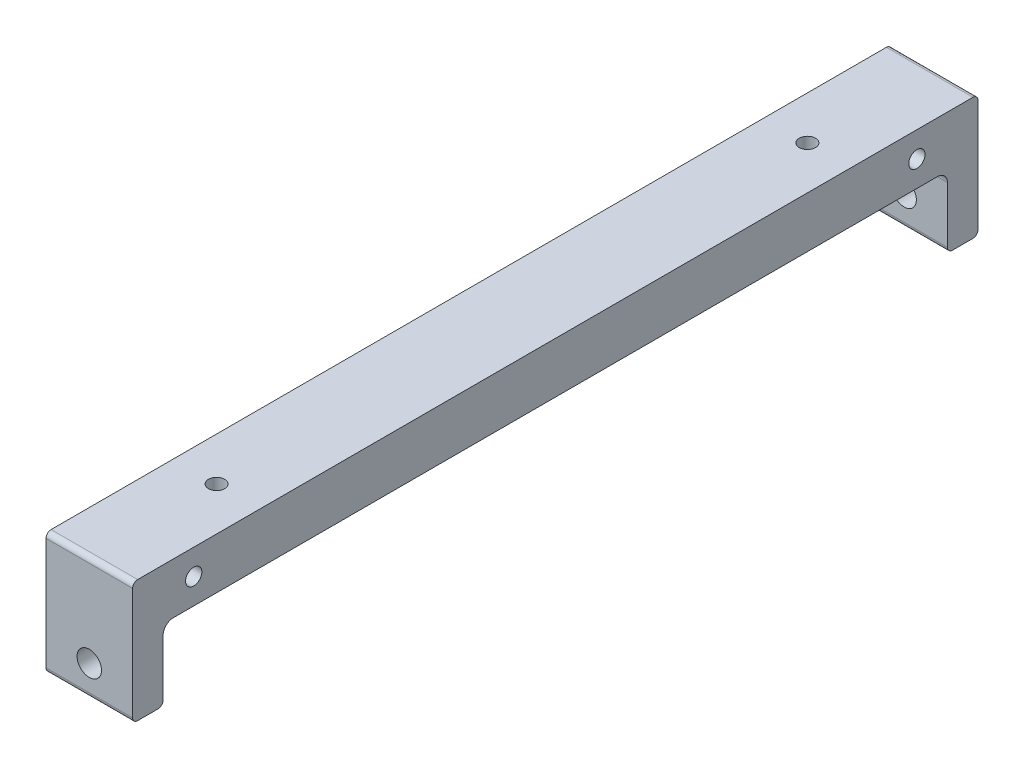
ISO-10303-21;
HEADER;
FILE_DESCRIPTION(('STEP AP214'),'2;1');
FILE_NAME('part.step','',(''),(''),'','','');
FILE_SCHEMA(('AUTOMOTIVE_DESIGN { 1 0 10303 214 1 1 1 1 }'));
ENDSEC;
DATA;
#1=APPLICATION_CONTEXT('core data for automotive mechanical design processes');
#2=APPLICATION_PROTOCOL_DEFINITION('international standard','automotive_design',2000,#1);
#3=PRODUCT_CONTEXT('',#1,'mechanical');
#4=PRODUCT('Part','Part','',(#3));
#5=PRODUCT_RELATED_PRODUCT_CATEGORY('part','',(#4));
#6=PRODUCT_DEFINITION_FORMATION('','',#4);
#7=PRODUCT_DEFINITION_CONTEXT('part definition',#1,'design');
#8=PRODUCT_DEFINITION('design','',#6,#7);
#9=PRODUCT_DEFINITION_SHAPE('','',#8);
#10=(LENGTH_UNIT() NAMED_UNIT(*) SI_UNIT(.MILLI.,.METRE.));
#11=(NAMED_UNIT(*) PLANE_ANGLE_UNIT() SI_UNIT($,.RADIAN.));
#12=(NAMED_UNIT(*) SI_UNIT($,.STERADIAN.) SOLID_ANGLE_UNIT());
#13=UNCERTAINTY_MEASURE_WITH_UNIT(LENGTH_MEASURE(1.E-05),#10,'distance_accuracy_value','');
#14=(GEOMETRIC_REPRESENTATION_CONTEXT(3) GLOBAL_UNCERTAINTY_ASSIGNED_CONTEXT((#13)) GLOBAL_UNIT_ASSIGNED_CONTEXT((#10,
#11,#12)) REPRESENTATION_CONTEXT('',''));
#15=CARTESIAN_POINT('',(0.,0.,0.));
#16=DIRECTION('',(0.,0.,1.));
#17=DIRECTION('',(1.,0.,0.));
#18=AXIS2_PLACEMENT_3D('',#15,#16,#17);
#19=CARTESIAN_POINT('',(-4.25,-6.,41.5));
#20=DIRECTION('',(0.,1.,0.));
#21=DIRECTION('',(0.,0.,1.));
#22=AXIS2_PLACEMENT_3D('',#19,#20,#21);
#23=PLANE('',#22);
#24=DIRECTION('',(0.,0.,-1.));
#25=VECTOR('',#24,1.);
#26=CARTESIAN_POINT('',(-4.25,-6.,41.5));
#27=LINE('',#26,#25);
#28=CARTESIAN_POINT('',(-4.25,-6.,41.));
#29=VERTEX_POINT('',#28);
#30=CARTESIAN_POINT('',(-4.25,-6.,39.));
#31=VERTEX_POINT('',#30);
#32=EDGE_CURVE('E272',#29,#31,#27,.T.);
#33=ORIENTED_EDGE('',*,*,#32,.T.);
#34=DIRECTION('',(1.,0.,0.));
#35=VECTOR('',#34,1.);
#36=CARTESIAN_POINT('',(-4.25,-6.,39.));
#37=LINE('',#36,#35);
#38=CARTESIAN_POINT('',(4.25,-6.,39.));
#39=VERTEX_POINT('',#38);
#40=EDGE_CURVE('E317',#31,#39,#37,.T.);
#41=ORIENTED_EDGE('',*,*,#40,.T.);
#42=DIRECTION('',(0.,0.,-1.));
#43=VECTOR('',#42,1.);
#44=CARTESIAN_POINT('',(4.25,-6.,41.5));
#45=LINE('',#44,#43);
#46=CARTESIAN_POINT('',(4.25,-6.,41.));
#47=VERTEX_POINT('',#46);
#48=EDGE_CURVE('E268',#47,#39,#45,.T.);
#49=ORIENTED_EDGE('',*,*,#48,.F.);
#50=DIRECTION('',(1.,0.,0.));
#51=VECTOR('',#50,1.);
#52=CARTESIAN_POINT('',(-4.25,-6.,41.));
#53=LINE('',#52,#51);
#54=EDGE_CURVE('E315',#47,#29,#53,.F.);
#55=ORIENTED_EDGE('',*,*,#54,.T.);
#56=EDGE_LOOP('',(#33,#41,#49,#55));
#57=FACE_BOUND('',#56,.T.);
#58=ADVANCED_FACE('F33',(#57),#23,.F.);
#59=CARTESIAN_POINT('',(4.25,-6.,41.5));
#60=DIRECTION('',(-1.,0.,0.));
#61=DIRECTION('',(0.,0.,1.));
#62=AXIS2_PLACEMENT_3D('',#59,#60,#61);
#63=PLANE('',#62);
#64=CARTESIAN_POINT('',(4.25,3.5,35.5));
#65=DIRECTION('',(1.,0.,0.));
#66=DIRECTION('',(0.,0.,-1.));
#67=AXIS2_PLACEMENT_3D('',#64,#65,#66);
#68=CIRCLE('',#67,0.799999999999999);
#69=CARTESIAN_POINT('',(4.25,3.5,34.7));
#70=VERTEX_POINT('',#69);
#71=EDGE_CURVE('E206',#70,#70,#68,.T.);
#72=ORIENTED_EDGE('',*,*,#71,.F.);
#73=EDGE_LOOP('',(#72));
#74=FACE_BOUND('',#73,.T.);
#75=CARTESIAN_POINT('',(4.25,3.5,-35.5));
#76=DIRECTION('',(1.,0.,0.));
#77=DIRECTION('',(0.,0.,-1.));
#78=AXIS2_PLACEMENT_3D('',#75,#76,#77);
#79=CIRCLE('',#78,0.799999999999999);
#80=CARTESIAN_POINT('',(4.25,3.5,-36.3));
#81=VERTEX_POINT('',#80);
#82=EDGE_CURVE('E212',#81,#81,#79,.T.);
#83=ORIENTED_EDGE('',*,*,#82,.F.);
#84=EDGE_LOOP('',(#83));
#85=FACE_BOUND('',#84,.T.);
#86=CARTESIAN_POINT('',(4.25,-6.,-39.));
#87=VERTEX_POINT('',#86);
#88=CARTESIAN_POINT('',(4.25,-6.,-41.));
#89=VERTEX_POINT('',#88);
#90=EDGE_CURVE('E263',#87,#89,#45,.T.);
#91=ORIENTED_EDGE('',*,*,#90,.T.);
#92=CARTESIAN_POINT('',(4.25,-5.5,-41.));
#93=DIRECTION('',(-1.,0.,0.));
#94=DIRECTION('',(0.,0.,1.));
#95=AXIS2_PLACEMENT_3D('',#92,#93,#94);
#96=CIRCLE('',#95,0.5);
#97=CARTESIAN_POINT('',(4.25,-5.5,-41.5));
#98=VERTEX_POINT('',#97);
#99=EDGE_CURVE('E296',#89,#98,#96,.F.);
#100=ORIENTED_EDGE('',*,*,#99,.T.);
#101=DIRECTION('',(0.,1.,0.));
#102=VECTOR('',#101,1.);
#103=CARTESIAN_POINT('',(4.25,-6.,-41.5));
#104=LINE('',#103,#102);
#105=CARTESIAN_POINT('',(4.25,5.5,-41.5));
#106=VERTEX_POINT('',#105);
#107=EDGE_CURVE('E249',#98,#106,#104,.T.);
#108=ORIENTED_EDGE('',*,*,#107,.T.);
#109=CARTESIAN_POINT('',(4.25,5.5,-41.));
#110=DIRECTION('',(-1.,0.,0.));
#111=DIRECTION('',(0.,0.,1.));
#112=AXIS2_PLACEMENT_3D('',#109,#110,#111);
#113=CIRCLE('',#112,0.5);
#114=CARTESIAN_POINT('',(4.25,6.,-41.));
#115=VERTEX_POINT('',#114);
#116=EDGE_CURVE('E288',#106,#115,#113,.F.);
#117=ORIENTED_EDGE('',*,*,#116,.T.);
#118=DIRECTION('',(0.,0.,-1.));
#119=VECTOR('',#118,1.);
#120=CARTESIAN_POINT('',(4.25,6.,41.5));
#121=LINE('',#120,#119);
#122=CARTESIAN_POINT('',(4.25,6.,41.));
#123=VERTEX_POINT('',#122);
#124=EDGE_CURVE('E278',#123,#115,#121,.T.);
#125=ORIENTED_EDGE('',*,*,#124,.F.);
#126=CARTESIAN_POINT('',(4.25,5.5,41.));
#127=DIRECTION('',(-1.,0.,0.));
#128=DIRECTION('',(0.,0.,1.));
#129=AXIS2_PLACEMENT_3D('',#126,#127,#128);
#130=CIRCLE('',#129,0.5);
#131=CARTESIAN_POINT('',(4.25,5.5,41.5));
#132=VERTEX_POINT('',#131);
#133=EDGE_CURVE('E286',#123,#132,#130,.F.);
#134=ORIENTED_EDGE('',*,*,#133,.T.);
#135=DIRECTION('',(0.,1.,0.));
#136=VECTOR('',#135,1.);
#137=CARTESIAN_POINT('',(4.25,-6.,41.5));
#138=LINE('',#137,#136);
#139=CARTESIAN_POINT('',(4.25,-5.5,41.5));
#140=VERTEX_POINT('',#139);
#141=EDGE_CURVE('E256',#140,#132,#138,.T.);
#142=ORIENTED_EDGE('',*,*,#141,.F.);
#143=CARTESIAN_POINT('',(4.25,-5.5,41.));
#144=DIRECTION('',(-1.,0.,0.));
#145=DIRECTION('',(0.,0.,1.));
#146=AXIS2_PLACEMENT_3D('',#143,#144,#145);
#147=CIRCLE('',#146,0.5);
#148=EDGE_CURVE('E290',#140,#47,#147,.F.);
#149=ORIENTED_EDGE('',*,*,#148,.T.);
#150=ORIENTED_EDGE('',*,*,#48,.T.);
#151=CARTESIAN_POINT('',(4.25,-5.5,39.));
#152=DIRECTION('',(-1.,0.,0.));
#153=DIRECTION('',(0.,0.,1.));
#154=AXIS2_PLACEMENT_3D('',#151,#152,#153);
#155=CIRCLE('',#154,0.5);
#156=CARTESIAN_POINT('',(4.25,-5.5,38.5));
#157=VERTEX_POINT('',#156);
#158=EDGE_CURVE('E292',#39,#157,#155,.F.);
#159=ORIENTED_EDGE('',*,*,#158,.T.);
#160=DIRECTION('',(0.,-1.,0.));
#161=VECTOR('',#160,1.);
#162=CARTESIAN_POINT('',(4.25,-6.00000000000001,38.5));
#163=LINE('',#162,#161);
#164=CARTESIAN_POINT('',(4.25,0.,38.5));
#165=VERTEX_POINT('',#164);
#166=EDGE_CURVE('E222',#165,#157,#163,.T.);
#167=ORIENTED_EDGE('',*,*,#166,.F.);
#168=CARTESIAN_POINT('',(4.25,0.,37.5));
#169=DIRECTION('',(1.,0.,0.));
#170=DIRECTION('',(0.,0.,-1.));
#171=AXIS2_PLACEMENT_3D('',#168,#169,#170);
#172=CIRCLE('',#171,1.);
#173=CARTESIAN_POINT('',(4.25,1.,37.5));
#174=VERTEX_POINT('',#173);
#175=EDGE_CURVE('E242',#174,#165,#172,.T.);
#176=ORIENTED_EDGE('',*,*,#175,.F.);
#177=DIRECTION('',(0.,0.,1.));
#178=VECTOR('',#177,1.);
#179=CARTESIAN_POINT('',(4.25,1.,37.5));
#180=LINE('',#179,#178);
#181=CARTESIAN_POINT('',(4.25,1.,-37.5));
#182=VERTEX_POINT('',#181);
#183=EDGE_CURVE('E239',#182,#174,#180,.T.);
#184=ORIENTED_EDGE('',*,*,#183,.F.);
#185=CARTESIAN_POINT('',(4.25,0.,-37.5));
#186=DIRECTION('',(1.,0.,0.));
#187=DIRECTION('',(0.,0.,1.));
#188=AXIS2_PLACEMENT_3D('',#185,#186,#187);
#189=CIRCLE('',#188,1.);
#190=CARTESIAN_POINT('',(4.25,0.,-38.5));
#191=VERTEX_POINT('',#190);
#192=EDGE_CURVE('E236',#191,#182,#189,.T.);
#193=ORIENTED_EDGE('',*,*,#192,.F.);
#194=DIRECTION('',(0.,1.,0.));
#195=VECTOR('',#194,1.);
#196=CARTESIAN_POINT('',(4.25,0.,-38.5));
#197=LINE('',#196,#195);
#198=CARTESIAN_POINT('',(4.25,-5.5,-38.5));
#199=VERTEX_POINT('',#198);
#200=EDGE_CURVE('E218',#199,#191,#197,.T.);
#201=ORIENTED_EDGE('',*,*,#200,.F.);
#202=CARTESIAN_POINT('',(4.25,-5.5,-39.));
#203=DIRECTION('',(-1.,0.,0.));
#204=DIRECTION('',(0.,0.,1.));
#205=AXIS2_PLACEMENT_3D('',#202,#203,#204);
#206=CIRCLE('',#205,0.5);
#207=EDGE_CURVE('E294',#199,#87,#206,.F.);
#208=ORIENTED_EDGE('',*,*,#207,.T.);
#209=EDGE_LOOP('',(#91,#100,#108,#117,#125,#134,#142,#149,#150,#159,#167,#176,#184,#193,#201,#208));
#210=FACE_BOUND('',#209,.T.);
#211=ADVANCED_FACE('F345',(#74,#85,#210),#63,.F.);
#212=CARTESIAN_POINT('',(-4.25,6.,41.5));
#213=DIRECTION('',(0.,-1.,0.));
#214=DIRECTION('',(0.,0.,-1.));
#215=AXIS2_PLACEMENT_3D('',#212,#213,#214);
#216=PLANE('',#215);
#217=CARTESIAN_POINT('',(0.,6.,-29.));
#218=DIRECTION('',(0.,1.,0.));
#219=DIRECTION('',(0.,0.,1.));
#220=AXIS2_PLACEMENT_3D('',#217,#218,#219);
#221=CIRCLE('',#220,0.799999999999998);
#222=CARTESIAN_POINT('',(0.,6.,-28.2));
#223=VERTEX_POINT('',#222);
#224=EDGE_CURVE('E172',#223,#223,#221,.T.);
#225=ORIENTED_EDGE('',*,*,#224,.F.);
#226=EDGE_LOOP('',(#225));
#227=FACE_BOUND('',#226,.T.);
#228=CARTESIAN_POINT('',(0.,6.,29.));
#229=DIRECTION('',(0.,1.,0.));
#230=DIRECTION('',(0.,0.,1.));
#231=AXIS2_PLACEMENT_3D('',#228,#229,#230);
#232=CIRCLE('',#231,0.799999999999998);
#233=CARTESIAN_POINT('',(0.,6.,29.8));
#234=VERTEX_POINT('',#233);
#235=EDGE_CURVE('E182',#234,#234,#232,.T.);
#236=ORIENTED_EDGE('',*,*,#235,.F.);
#237=EDGE_LOOP('',(#236));
#238=FACE_BOUND('',#237,.T.);
#239=ORIENTED_EDGE('',*,*,#124,.T.);
#240=DIRECTION('',(-1.,0.,0.));
#241=VECTOR('',#240,1.);
#242=CARTESIAN_POINT('',(-4.25,6.,-41.));
#243=LINE('',#242,#241);
#244=CARTESIAN_POINT('',(-4.25,6.,-41.));
#245=VERTEX_POINT('',#244);
#246=EDGE_CURVE('E11',#115,#245,#243,.T.);
#247=ORIENTED_EDGE('',*,*,#246,.T.);
#248=DIRECTION('',(0.,0.,-1.));
#249=VECTOR('',#248,1.);
#250=CARTESIAN_POINT('',(-4.25,6.,41.5));
#251=LINE('',#250,#249);
#252=CARTESIAN_POINT('',(-4.25,6.,41.));
#253=VERTEX_POINT('',#252);
#254=EDGE_CURVE('E275',#253,#245,#251,.T.);
#255=ORIENTED_EDGE('',*,*,#254,.F.);
#256=DIRECTION('',(-1.,0.,0.));
#257=VECTOR('',#256,1.);
#258=CARTESIAN_POINT('',(-4.25,6.,41.));
#259=LINE('',#258,#257);
#260=EDGE_CURVE('E42',#253,#123,#259,.F.);
#261=ORIENTED_EDGE('',*,*,#260,.T.);
#262=EDGE_LOOP('',(#239,#247,#255,#261));
#263=FACE_BOUND('',#262,.T.);
#264=ADVANCED_FACE('F353',(#227,#238,#263),#216,.F.);
#265=CARTESIAN_POINT('',(-4.25,-6.,41.5));
#266=DIRECTION('',(1.,0.,0.));
#267=DIRECTION('',(0.,0.,-1.));
#268=AXIS2_PLACEMENT_3D('',#265,#266,#267);
#269=PLANE('',#268);
#270=CARTESIAN_POINT('',(-4.25,3.5,0.));
#271=DIRECTION('',(-1.,0.,0.));
#272=DIRECTION('',(0.,0.,1.));
#273=AXIS2_PLACEMENT_3D('',#270,#271,#272);
#274=CIRCLE('',#273,0.799999999999999);
#275=CARTESIAN_POINT('',(-4.25,3.5,0.799999999999999));
#276=VERTEX_POINT('',#275);
#277=EDGE_CURVE('E173',#276,#276,#274,.T.);
#278=ORIENTED_EDGE('',*,*,#277,.F.);
#279=EDGE_LOOP('',(#278));
#280=FACE_BOUND('',#279,.T.);
#281=CARTESIAN_POINT('',(-4.25,3.5,-21.5));
#282=DIRECTION('',(-1.,0.,0.));
#283=DIRECTION('',(0.,0.,1.));
#284=AXIS2_PLACEMENT_3D('',#281,#282,#283);
#285=CIRCLE('',#284,0.799999999999999);
#286=CARTESIAN_POINT('',(-4.25,3.5,-20.7));
#287=VERTEX_POINT('',#286);
#288=EDGE_CURVE('E194',#287,#287,#285,.T.);
#289=ORIENTED_EDGE('',*,*,#288,.F.);
#290=EDGE_LOOP('',(#289));
#291=FACE_BOUND('',#290,.T.);
#292=CARTESIAN_POINT('',(-4.25,3.5,21.5));
#293=DIRECTION('',(-1.,0.,0.));
#294=DIRECTION('',(0.,0.,1.));
#295=AXIS2_PLACEMENT_3D('',#292,#293,#294);
#296=CIRCLE('',#295,0.799999999999999);
#297=CARTESIAN_POINT('',(-4.25,3.5,22.3));
#298=VERTEX_POINT('',#297);
#299=EDGE_CURVE('E200',#298,#298,#296,.T.);
#300=ORIENTED_EDGE('',*,*,#299,.F.);
#301=EDGE_LOOP('',(#300));
#302=FACE_BOUND('',#301,.T.);
#303=DIRECTION('',(0.,-1.,0.));
#304=VECTOR('',#303,1.);
#305=CARTESIAN_POINT('',(-4.25,-6.,-41.5));
#306=LINE('',#305,#304);
#307=CARTESIAN_POINT('',(-4.25,5.5,-41.5));
#308=VERTEX_POINT('',#307);
#309=CARTESIAN_POINT('',(-4.25,-5.5,-41.5));
#310=VERTEX_POINT('',#309);
#311=EDGE_CURVE('E260',#308,#310,#306,.T.);
#312=ORIENTED_EDGE('',*,*,#311,.T.);
#313=CARTESIAN_POINT('',(-4.25,-5.5,-41.));
#314=DIRECTION('',(1.,0.,0.));
#315=DIRECTION('',(0.,0.,-1.));
#316=AXIS2_PLACEMENT_3D('',#313,#314,#315);
#317=CIRCLE('',#316,0.5);
#318=CARTESIAN_POINT('',(-4.25,-6.,-41.));
#319=VERTEX_POINT('',#318);
#320=EDGE_CURVE('E310',#310,#319,#317,.F.);
#321=ORIENTED_EDGE('',*,*,#320,.T.);
#322=CARTESIAN_POINT('',(-4.25,-6.,-39.));
#323=VERTEX_POINT('',#322);
#324=EDGE_CURVE('E271',#323,#319,#27,.T.);
#325=ORIENTED_EDGE('',*,*,#324,.F.);
#326=CARTESIAN_POINT('',(-4.25,-5.5,-39.));
#327=DIRECTION('',(1.,0.,0.));
#328=DIRECTION('',(0.,0.,-1.));
#329=AXIS2_PLACEMENT_3D('',#326,#327,#328);
#330=CIRCLE('',#329,0.5);
#331=CARTESIAN_POINT('',(-4.25,-5.5,-38.5));
#332=VERTEX_POINT('',#331);
#333=EDGE_CURVE('E50',#323,#332,#330,.F.);
#334=ORIENTED_EDGE('',*,*,#333,.T.);
#335=DIRECTION('',(0.,1.,0.));
#336=VECTOR('',#335,1.);
#337=CARTESIAN_POINT('',(-4.25,0.,-38.5));
#338=LINE('',#337,#336);
#339=CARTESIAN_POINT('',(-4.25,0.,-38.5));
#340=VERTEX_POINT('',#339);
#341=EDGE_CURVE('E219',#332,#340,#338,.T.);
#342=ORIENTED_EDGE('',*,*,#341,.T.);
#343=CARTESIAN_POINT('',(-4.25,0.,-37.5));
#344=DIRECTION('',(1.,0.,0.));
#345=DIRECTION('',(0.,0.,1.));
#346=AXIS2_PLACEMENT_3D('',#343,#344,#345);
#347=CIRCLE('',#346,1.);
#348=CARTESIAN_POINT('',(-4.25,1.,-37.5));
#349=VERTEX_POINT('',#348);
#350=EDGE_CURVE('E221',#340,#349,#347,.T.);
#351=ORIENTED_EDGE('',*,*,#350,.T.);
#352=DIRECTION('',(0.,0.,1.));
#353=VECTOR('',#352,1.);
#354=CARTESIAN_POINT('',(-4.25,1.,37.5));
#355=LINE('',#354,#353);
#356=CARTESIAN_POINT('',(-4.25,1.,37.5));
#357=VERTEX_POINT('',#356);
#358=EDGE_CURVE('E225',#349,#357,#355,.T.);
#359=ORIENTED_EDGE('',*,*,#358,.T.);
#360=CARTESIAN_POINT('',(-4.25,0.,37.5));
#361=DIRECTION('',(1.,0.,0.));
#362=DIRECTION('',(0.,0.,-1.));
#363=AXIS2_PLACEMENT_3D('',#360,#361,#362);
#364=CIRCLE('',#363,1.);
#365=CARTESIAN_POINT('',(-4.25,0.,38.5));
#366=VERTEX_POINT('',#365);
#367=EDGE_CURVE('E228',#357,#366,#364,.T.);
#368=ORIENTED_EDGE('',*,*,#367,.T.);
#369=DIRECTION('',(0.,-1.,0.));
#370=VECTOR('',#369,1.);
#371=CARTESIAN_POINT('',(-4.25,-6.00000000000001,38.5));
#372=LINE('',#371,#370);
#373=CARTESIAN_POINT('',(-4.25,-5.5,38.5));
#374=VERTEX_POINT('',#373);
#375=EDGE_CURVE('E231',#366,#374,#372,.T.);
#376=ORIENTED_EDGE('',*,*,#375,.T.);
#377=CARTESIAN_POINT('',(-4.25,-5.5,39.));
#378=DIRECTION('',(1.,0.,0.));
#379=DIRECTION('',(0.,0.,-1.));
#380=AXIS2_PLACEMENT_3D('',#377,#378,#379);
#381=CIRCLE('',#380,0.5);
#382=EDGE_CURVE('E307',#374,#31,#381,.F.);
#383=ORIENTED_EDGE('',*,*,#382,.T.);
#384=ORIENTED_EDGE('',*,*,#32,.F.);
#385=CARTESIAN_POINT('',(-4.25,-5.5,41.));
#386=DIRECTION('',(1.,0.,0.));
#387=DIRECTION('',(0.,0.,-1.));
#388=AXIS2_PLACEMENT_3D('',#385,#386,#387);
#389=CIRCLE('',#388,0.5);
#390=CARTESIAN_POINT('',(-4.25,-5.5,41.5));
#391=VERTEX_POINT('',#390);
#392=EDGE_CURVE('E305',#29,#391,#389,.F.);
#393=ORIENTED_EDGE('',*,*,#392,.T.);
#394=DIRECTION('',(0.,-1.,0.));
#395=VECTOR('',#394,1.);
#396=CARTESIAN_POINT('',(-4.25,-6.,41.5));
#397=LINE('',#396,#395);
#398=CARTESIAN_POINT('',(-4.25,5.5,41.5));
#399=VERTEX_POINT('',#398);
#400=EDGE_CURVE('E259',#399,#391,#397,.T.);
#401=ORIENTED_EDGE('',*,*,#400,.F.);
#402=CARTESIAN_POINT('',(-4.25,5.5,41.));
#403=DIRECTION('',(1.,0.,0.));
#404=DIRECTION('',(0.,0.,-1.));
#405=AXIS2_PLACEMENT_3D('',#402,#403,#404);
#406=CIRCLE('',#405,0.5);
#407=EDGE_CURVE('E302',#399,#253,#406,.F.);
#408=ORIENTED_EDGE('',*,*,#407,.T.);
#409=ORIENTED_EDGE('',*,*,#254,.T.);
#410=CARTESIAN_POINT('',(-4.25,5.5,-41.));
#411=DIRECTION('',(1.,0.,0.));
#412=DIRECTION('',(0.,0.,-1.));
#413=AXIS2_PLACEMENT_3D('',#410,#411,#412);
#414=CIRCLE('',#413,0.5);
#415=EDGE_CURVE('E58',#245,#308,#414,.F.);
#416=ORIENTED_EDGE('',*,*,#415,.T.);
#417=EDGE_LOOP('',(#312,#321,#325,#334,#342,#351,#359,#368,#376,#383,#384,#393,#401,#408,#409,#416));
#418=FACE_BOUND('',#417,.T.);
#419=ADVANCED_FACE('F360',(#280,#291,#302,#418),#269,.F.);
#420=ORIENTED_EDGE('',*,*,#324,.T.);
#421=DIRECTION('',(1.,0.,0.));
#422=VECTOR('',#421,1.);
#423=CARTESIAN_POINT('',(4.25,-6.,-41.));
#424=LINE('',#423,#422);
#425=EDGE_CURVE('E283',#319,#89,#424,.T.);
#426=ORIENTED_EDGE('',*,*,#425,.T.);
#427=ORIENTED_EDGE('',*,*,#90,.F.);
#428=DIRECTION('',(1.,0.,0.));
#429=VECTOR('',#428,1.);
#430=CARTESIAN_POINT('',(-4.25,-6.,-39.));
#431=LINE('',#430,#429);
#432=EDGE_CURVE('E281',#87,#323,#431,.F.);
#433=ORIENTED_EDGE('',*,*,#432,.T.);
#434=EDGE_LOOP('',(#420,#426,#427,#433));
#435=FACE_BOUND('',#434,.T.);
#436=ADVANCED_FACE('F348',(#435),#23,.F.);
#437=CARTESIAN_POINT('',(0.,0.,41.5));
#438=DIRECTION('',(0.,0.,-1.));
#439=DIRECTION('',(-1.,0.,0.));
#440=AXIS2_PLACEMENT_3D('',#437,#438,#439);
#441=PLANE('',#440);
#442=CARTESIAN_POINT('',(0.,-3.,41.5));
#443=DIRECTION('',(0.,0.,1.));
#444=DIRECTION('',(1.,0.,0.));
#445=AXIS2_PLACEMENT_3D('',#442,#443,#444);
#446=CIRCLE('',#445,1.2);
#447=CARTESIAN_POINT('',(1.2,-3.,41.5));
#448=VERTEX_POINT('',#447);
#449=EDGE_CURVE('E188',#448,#448,#446,.T.);
#450=ORIENTED_EDGE('',*,*,#449,.F.);
#451=EDGE_LOOP('',(#450));
#452=FACE_BOUND('',#451,.T.);
#453=ORIENTED_EDGE('',*,*,#400,.T.);
#454=DIRECTION('',(1.,0.,0.));
#455=VECTOR('',#454,1.);
#456=CARTESIAN_POINT('',(0.,-5.5,41.5));
#457=LINE('',#456,#455);
#458=EDGE_CURVE('E325',#391,#140,#457,.T.);
#459=ORIENTED_EDGE('',*,*,#458,.T.);
#460=ORIENTED_EDGE('',*,*,#141,.T.);
#461=DIRECTION('',(-1.,0.,0.));
#462=VECTOR('',#461,1.);
#463=CARTESIAN_POINT('',(0.,5.5,41.5));
#464=LINE('',#463,#462);
#465=EDGE_CURVE('E322',#132,#399,#464,.T.);
#466=ORIENTED_EDGE('',*,*,#465,.T.);
#467=EDGE_LOOP('',(#453,#459,#460,#466));
#468=FACE_BOUND('',#467,.T.);
#469=ADVANCED_FACE('F359',(#452,#468),#441,.F.);
#470=CARTESIAN_POINT('',(0.,0.,-41.5));
#471=DIRECTION('',(0.,0.,-1.));
#472=DIRECTION('',(-1.,0.,0.));
#473=AXIS2_PLACEMENT_3D('',#470,#471,#472);
#474=PLANE('',#473);
#475=CARTESIAN_POINT('',(0.,-3.,-41.5));
#476=DIRECTION('',(0.,0.,-1.));
#477=DIRECTION('',(-1.,0.,0.));
#478=AXIS2_PLACEMENT_3D('',#475,#476,#477);
#479=CIRCLE('',#478,1.19999999999999);
#480=CARTESIAN_POINT('',(-1.19999999999999,-3.,-41.5));
#481=VERTEX_POINT('',#480);
#482=EDGE_CURVE('E479',#481,#481,#479,.T.);
#483=ORIENTED_EDGE('',*,*,#482,.F.);
#484=EDGE_LOOP('',(#483));
#485=FACE_BOUND('',#484,.T.);
#486=ORIENTED_EDGE('',*,*,#107,.F.);
#487=DIRECTION('',(1.,0.,0.));
#488=VECTOR('',#487,1.);
#489=CARTESIAN_POINT('',(-4.25,-5.5,-41.5));
#490=LINE('',#489,#488);
#491=EDGE_CURVE('E300',#98,#310,#490,.F.);
#492=ORIENTED_EDGE('',*,*,#491,.T.);
#493=ORIENTED_EDGE('',*,*,#311,.F.);
#494=DIRECTION('',(-1.,0.,0.));
#495=VECTOR('',#494,1.);
#496=CARTESIAN_POINT('',(4.25,5.5,-41.5));
#497=LINE('',#496,#495);
#498=EDGE_CURVE('E298',#308,#106,#497,.F.);
#499=ORIENTED_EDGE('',*,*,#498,.T.);
#500=EDGE_LOOP('',(#486,#492,#493,#499));
#501=FACE_BOUND('',#500,.T.);
#502=ADVANCED_FACE('F367',(#485,#501),#474,.T.);
#503=CARTESIAN_POINT('',(-4.25,-6.00000000000001,38.5));
#504=DIRECTION('',(0.,0.,1.));
#505=DIRECTION('',(1.,0.,0.));
#506=AXIS2_PLACEMENT_3D('',#503,#504,#505);
#507=PLANE('',#506);
#508=CARTESIAN_POINT('',(0.,-3.,38.5));
#509=DIRECTION('',(0.,0.,1.));
#510=DIRECTION('',(1.,0.,0.));
#511=AXIS2_PLACEMENT_3D('',#508,#509,#510);
#512=CIRCLE('',#511,1.2);
#513=CARTESIAN_POINT('',(1.2,-3.,38.5));
#514=VERTEX_POINT('',#513);
#515=EDGE_CURVE('E191',#514,#514,#512,.T.);
#516=ORIENTED_EDGE('',*,*,#515,.T.);
#517=EDGE_LOOP('',(#516));
#518=FACE_BOUND('',#517,.T.);
#519=ORIENTED_EDGE('',*,*,#166,.T.);
#520=DIRECTION('',(1.,0.,0.));
#521=VECTOR('',#520,1.);
#522=CARTESIAN_POINT('',(-4.25,-5.5,38.5));
#523=LINE('',#522,#521);
#524=EDGE_CURVE('E320',#157,#374,#523,.F.);
#525=ORIENTED_EDGE('',*,*,#524,.T.);
#526=ORIENTED_EDGE('',*,*,#375,.F.);
#527=DIRECTION('',(1.,0.,0.));
#528=VECTOR('',#527,1.);
#529=CARTESIAN_POINT('',(-4.25,0.,38.5));
#530=LINE('',#529,#528);
#531=EDGE_CURVE('E247',#366,#165,#530,.T.);
#532=ORIENTED_EDGE('',*,*,#531,.T.);
#533=EDGE_LOOP('',(#519,#525,#526,#532));
#534=FACE_BOUND('',#533,.T.);
#535=ADVANCED_FACE('F412',(#518,#534),#507,.F.);
#536=CARTESIAN_POINT('',(-4.25,0.,37.5));
#537=DIRECTION('',(1.,0.,0.));
#538=DIRECTION('',(0.,0.,-1.));
#539=AXIS2_PLACEMENT_3D('',#536,#537,#538);
#540=CYLINDRICAL_SURFACE('',#539,1.);
#541=ORIENTED_EDGE('',*,*,#175,.T.);
#542=ORIENTED_EDGE('',*,*,#531,.F.);
#543=ORIENTED_EDGE('',*,*,#367,.F.);
#544=DIRECTION('',(1.,0.,0.));
#545=VECTOR('',#544,1.);
#546=CARTESIAN_POINT('',(-4.25,1.,37.5));
#547=LINE('',#546,#545);
#548=EDGE_CURVE('E250',#357,#174,#547,.T.);
#549=ORIENTED_EDGE('',*,*,#548,.T.);
#550=EDGE_LOOP('',(#541,#542,#543,#549));
#551=FACE_BOUND('',#550,.T.);
#552=ADVANCED_FACE('F416',(#551),#540,.F.);
#553=CARTESIAN_POINT('',(-4.25,1.,37.5));
#554=DIRECTION('',(0.,1.,0.));
#555=DIRECTION('',(0.,0.,1.));
#556=AXIS2_PLACEMENT_3D('',#553,#554,#555);
#557=PLANE('',#556);
#558=CARTESIAN_POINT('',(0.,1.,-29.));
#559=DIRECTION('',(0.,1.,0.));
#560=DIRECTION('',(0.,0.,1.));
#561=AXIS2_PLACEMENT_3D('',#558,#559,#560);
#562=CIRCLE('',#561,0.799999999999998);
#563=CARTESIAN_POINT('',(0.,1.,-28.2));
#564=VERTEX_POINT('',#563);
#565=EDGE_CURVE('E176',#564,#564,#562,.T.);
#566=ORIENTED_EDGE('',*,*,#565,.T.);
#567=EDGE_LOOP('',(#566));
#568=FACE_BOUND('',#567,.T.);
#569=CARTESIAN_POINT('',(0.,1.,29.));
#570=DIRECTION('',(0.,1.,0.));
#571=DIRECTION('',(0.,0.,1.));
#572=AXIS2_PLACEMENT_3D('',#569,#570,#571);
#573=CIRCLE('',#572,0.799999999999998);
#574=CARTESIAN_POINT('',(0.,1.,29.8));
#575=VERTEX_POINT('',#574);
#576=EDGE_CURVE('E185',#575,#575,#573,.T.);
#577=ORIENTED_EDGE('',*,*,#576,.T.);
#578=EDGE_LOOP('',(#577));
#579=FACE_BOUND('',#578,.T.);
#580=ORIENTED_EDGE('',*,*,#183,.T.);
#581=ORIENTED_EDGE('',*,*,#548,.F.);
#582=ORIENTED_EDGE('',*,*,#358,.F.);
#583=DIRECTION('',(1.,0.,0.));
#584=VECTOR('',#583,1.);
#585=CARTESIAN_POINT('',(-4.25,1.,-37.5));
#586=LINE('',#585,#584);
#587=EDGE_CURVE('E252',#349,#182,#586,.T.);
#588=ORIENTED_EDGE('',*,*,#587,.T.);
#589=EDGE_LOOP('',(#580,#581,#582,#588));
#590=FACE_BOUND('',#589,.T.);
#591=ADVANCED_FACE('F331',(#568,#579,#590),#557,.F.);
#592=CARTESIAN_POINT('',(-4.25,0.,-37.5));
#593=DIRECTION('',(1.,0.,0.));
#594=DIRECTION('',(0.,0.,-1.));
#595=AXIS2_PLACEMENT_3D('',#592,#593,#594);
#596=CYLINDRICAL_SURFACE('',#595,1.);
#597=ORIENTED_EDGE('',*,*,#192,.T.);
#598=ORIENTED_EDGE('',*,*,#587,.F.);
#599=ORIENTED_EDGE('',*,*,#350,.F.);
#600=DIRECTION('',(1.,0.,0.));
#601=VECTOR('',#600,1.);
#602=CARTESIAN_POINT('',(-4.25,0.,-38.5));
#603=LINE('',#602,#601);
#604=EDGE_CURVE('E234',#340,#191,#603,.T.);
#605=ORIENTED_EDGE('',*,*,#604,.T.);
#606=EDGE_LOOP('',(#597,#598,#599,#605));
#607=FACE_BOUND('',#606,.T.);
#608=ADVANCED_FACE('F424',(#607),#596,.F.);
#609=CARTESIAN_POINT('',(-4.25,0.,-38.5));
#610=DIRECTION('',(0.,0.,-1.));
#611=DIRECTION('',(0.,1.,0.));
#612=AXIS2_PLACEMENT_3D('',#609,#610,#611);
#613=PLANE('',#612);
#614=CARTESIAN_POINT('',(0.,-3.,-38.5));
#615=DIRECTION('',(0.,0.,-1.));
#616=DIRECTION('',(0.,1.,0.));
#617=AXIS2_PLACEMENT_3D('',#614,#615,#616);
#618=CIRCLE('',#617,1.19999999999999);
#619=CARTESIAN_POINT('',(0.,-1.80000000000001,-38.5));
#620=VERTEX_POINT('',#619);
#621=EDGE_CURVE('E37',#620,#620,#618,.T.);
#622=ORIENTED_EDGE('',*,*,#621,.T.);
#623=EDGE_LOOP('',(#622));
#624=FACE_BOUND('',#623,.T.);
#625=ORIENTED_EDGE('',*,*,#341,.F.);
#626=DIRECTION('',(1.,0.,0.));
#627=VECTOR('',#626,1.);
#628=CARTESIAN_POINT('',(-4.25,-5.5,-38.5));
#629=LINE('',#628,#627);
#630=EDGE_CURVE('E312',#332,#199,#629,.T.);
#631=ORIENTED_EDGE('',*,*,#630,.T.);
#632=ORIENTED_EDGE('',*,*,#200,.T.);
#633=ORIENTED_EDGE('',*,*,#604,.F.);
#634=EDGE_LOOP('',(#625,#631,#632,#633));
#635=FACE_BOUND('',#634,.T.);
#636=ADVANCED_FACE('F427',(#624,#635),#613,.F.);
#637=CARTESIAN_POINT('',(-4.25,-5.5,-41.));
#638=DIRECTION('',(-1.,0.,0.));
#639=DIRECTION('',(0.,0.,1.));
#640=AXIS2_PLACEMENT_3D('',#637,#638,#639);
#641=CYLINDRICAL_SURFACE('',#640,0.5);
#642=ORIENTED_EDGE('',*,*,#320,.F.);
#643=ORIENTED_EDGE('',*,*,#491,.F.);
#644=ORIENTED_EDGE('',*,*,#99,.F.);
#645=ORIENTED_EDGE('',*,*,#425,.F.);
#646=EDGE_LOOP('',(#642,#643,#644,#645));
#647=FACE_BOUND('',#646,.T.);
#648=ADVANCED_FACE('F379',(#647),#641,.T.);
#649=CARTESIAN_POINT('',(-4.25,-5.5,-39.));
#650=DIRECTION('',(1.,0.,0.));
#651=DIRECTION('',(0.,0.,-1.));
#652=AXIS2_PLACEMENT_3D('',#649,#650,#651);
#653=CYLINDRICAL_SURFACE('',#652,0.5);
#654=ORIENTED_EDGE('',*,*,#333,.F.);
#655=ORIENTED_EDGE('',*,*,#432,.F.);
#656=ORIENTED_EDGE('',*,*,#207,.F.);
#657=ORIENTED_EDGE('',*,*,#630,.F.);
#658=EDGE_LOOP('',(#654,#655,#656,#657));
#659=FACE_BOUND('',#658,.T.);
#660=ADVANCED_FACE('F430',(#659),#653,.T.);
#661=CARTESIAN_POINT('',(-4.25,-5.5,39.));
#662=DIRECTION('',(1.,0.,0.));
#663=DIRECTION('',(0.,0.,-1.));
#664=AXIS2_PLACEMENT_3D('',#661,#662,#663);
#665=CYLINDRICAL_SURFACE('',#664,0.5);
#666=ORIENTED_EDGE('',*,*,#382,.F.);
#667=ORIENTED_EDGE('',*,*,#524,.F.);
#668=ORIENTED_EDGE('',*,*,#158,.F.);
#669=ORIENTED_EDGE('',*,*,#40,.F.);
#670=EDGE_LOOP('',(#666,#667,#668,#669));
#671=FACE_BOUND('',#670,.T.);
#672=ADVANCED_FACE('F407',(#671),#665,.T.);
#673=CARTESIAN_POINT('',(0.,-5.5,41.));
#674=DIRECTION('',(1.,0.,0.));
#675=DIRECTION('',(0.,0.,-1.));
#676=AXIS2_PLACEMENT_3D('',#673,#674,#675);
#677=CYLINDRICAL_SURFACE('',#676,0.5);
#678=ORIENTED_EDGE('',*,*,#392,.F.);
#679=ORIENTED_EDGE('',*,*,#54,.F.);
#680=ORIENTED_EDGE('',*,*,#148,.F.);
#681=ORIENTED_EDGE('',*,*,#458,.F.);
#682=EDGE_LOOP('',(#678,#679,#680,#681));
#683=FACE_BOUND('',#682,.T.);
#684=ADVANCED_FACE('F400',(#683),#677,.T.);
#685=CARTESIAN_POINT('',(-4.25,5.5,-41.));
#686=DIRECTION('',(1.,0.,0.));
#687=DIRECTION('',(0.,0.,-1.));
#688=AXIS2_PLACEMENT_3D('',#685,#686,#687);
#689=CYLINDRICAL_SURFACE('',#688,0.5);
#690=ORIENTED_EDGE('',*,*,#116,.F.);
#691=ORIENTED_EDGE('',*,*,#498,.F.);
#692=ORIENTED_EDGE('',*,*,#415,.F.);
#693=ORIENTED_EDGE('',*,*,#246,.F.);
#694=EDGE_LOOP('',(#690,#691,#692,#693));
#695=FACE_BOUND('',#694,.T.);
#696=ADVANCED_FACE('F386',(#695),#689,.T.);
#697=CARTESIAN_POINT('',(0.,5.5,41.));
#698=DIRECTION('',(-1.,0.,0.));
#699=DIRECTION('',(0.,0.,1.));
#700=AXIS2_PLACEMENT_3D('',#697,#698,#699);
#701=CYLINDRICAL_SURFACE('',#700,0.5);
#702=ORIENTED_EDGE('',*,*,#133,.F.);
#703=ORIENTED_EDGE('',*,*,#260,.F.);
#704=ORIENTED_EDGE('',*,*,#407,.F.);
#705=ORIENTED_EDGE('',*,*,#465,.F.);
#706=EDGE_LOOP('',(#702,#703,#704,#705));
#707=FACE_BOUND('',#706,.T.);
#708=ADVANCED_FACE('F35',(#707),#701,.T.);
#709=CARTESIAN_POINT('',(-0.750000000000002,3.5,-35.5));
#710=DIRECTION('',(1.,0.,0.));
#711=DIRECTION('',(0.,0.,-1.));
#712=AXIS2_PLACEMENT_3D('',#709,#710,#711);
#713=CONICAL_SURFACE('',#712,0.799999999999999,1.02974425867665);
#714=CARTESIAN_POINT('',(-1.23068849522205,3.5,-35.5));
#715=VERTEX_POINT('',#714);
#716=VERTEX_LOOP('',#715);
#717=FACE_BOUND('',#716,.T.);
#718=CARTESIAN_POINT('',(-0.750000000000002,3.5,-35.5));
#719=DIRECTION('',(1.,0.,0.));
#720=DIRECTION('',(0.,0.,-1.));
#721=AXIS2_PLACEMENT_3D('',#718,#719,#720);
#722=CIRCLE('',#721,0.799999999999999);
#723=CARTESIAN_POINT('',(-0.750000000000002,3.5,-36.3));
#724=VERTEX_POINT('',#723);
#725=EDGE_CURVE('E215',#724,#724,#722,.T.);
#726=ORIENTED_EDGE('',*,*,#725,.T.);
#727=EDGE_LOOP('',(#726));
#728=FACE_BOUND('',#727,.T.);
#729=ADVANCED_FACE('F445',(#717,#728),#713,.F.);
#730=CARTESIAN_POINT('',(4.25,3.5,-35.5));
#731=DIRECTION('',(1.,0.,0.));
#732=DIRECTION('',(0.,0.,-1.));
#733=AXIS2_PLACEMENT_3D('',#730,#731,#732);
#734=CYLINDRICAL_SURFACE('',#733,0.799999999999999);
#735=ORIENTED_EDGE('',*,*,#725,.F.);
#736=EDGE_LOOP('',(#735));
#737=FACE_BOUND('',#736,.T.);
#738=ORIENTED_EDGE('',*,*,#82,.T.);
#739=EDGE_LOOP('',(#738));
#740=FACE_BOUND('',#739,.T.);
#741=ADVANCED_FACE('F449',(#737,#740),#734,.F.);
#742=CARTESIAN_POINT('',(-0.750000000000002,3.5,35.5));
#743=DIRECTION('',(1.,0.,0.));
#744=DIRECTION('',(0.,0.,-1.));
#745=AXIS2_PLACEMENT_3D('',#742,#743,#744);
#746=CONICAL_SURFACE('',#745,0.799999999999999,1.02974425867665);
#747=CARTESIAN_POINT('',(-1.23068849522205,3.5,35.5));
#748=VERTEX_POINT('',#747);
#749=VERTEX_LOOP('',#748);
#750=FACE_BOUND('',#749,.T.);
#751=CARTESIAN_POINT('',(-0.750000000000002,3.5,35.5));
#752=DIRECTION('',(1.,0.,0.));
#753=DIRECTION('',(0.,0.,-1.));
#754=AXIS2_PLACEMENT_3D('',#751,#752,#753);
#755=CIRCLE('',#754,0.799999999999999);
#756=CARTESIAN_POINT('',(-0.750000000000002,3.5,34.7));
#757=VERTEX_POINT('',#756);
#758=EDGE_CURVE('E209',#757,#757,#755,.T.);
#759=ORIENTED_EDGE('',*,*,#758,.T.);
#760=EDGE_LOOP('',(#759));
#761=FACE_BOUND('',#760,.T.);
#762=ADVANCED_FACE('F455',(#750,#761),#746,.F.);
#763=CARTESIAN_POINT('',(4.25,3.5,35.5));
#764=DIRECTION('',(1.,0.,0.));
#765=DIRECTION('',(0.,0.,-1.));
#766=AXIS2_PLACEMENT_3D('',#763,#764,#765);
#767=CYLINDRICAL_SURFACE('',#766,0.799999999999999);
#768=ORIENTED_EDGE('',*,*,#758,.F.);
#769=EDGE_LOOP('',(#768));
#770=FACE_BOUND('',#769,.T.);
#771=ORIENTED_EDGE('',*,*,#71,.T.);
#772=EDGE_LOOP('',(#771));
#773=FACE_BOUND('',#772,.T.);
#774=ADVANCED_FACE('F512',(#770,#773),#767,.F.);
#775=CARTESIAN_POINT('',(0.749999999999998,3.5,21.5));
#776=DIRECTION('',(-1.,0.,0.));
#777=DIRECTION('',(0.,0.,1.));
#778=AXIS2_PLACEMENT_3D('',#775,#776,#777);
#779=CONICAL_SURFACE('',#778,0.799999999999999,1.02974425867665);
#780=CARTESIAN_POINT('',(1.23068849522205,3.5,21.5));
#781=VERTEX_POINT('',#780);
#782=VERTEX_LOOP('',#781);
#783=FACE_BOUND('',#782,.T.);
#784=CARTESIAN_POINT('',(0.749999999999998,3.5,21.5));
#785=DIRECTION('',(-1.,0.,0.));
#786=DIRECTION('',(0.,0.,1.));
#787=AXIS2_PLACEMENT_3D('',#784,#785,#786);
#788=CIRCLE('',#787,0.799999999999999);
#789=CARTESIAN_POINT('',(0.749999999999998,3.5,22.3));
#790=VERTEX_POINT('',#789);
#791=EDGE_CURVE('E203',#790,#790,#788,.T.);
#792=ORIENTED_EDGE('',*,*,#791,.T.);
#793=EDGE_LOOP('',(#792));
#794=FACE_BOUND('',#793,.T.);
#795=ADVANCED_FACE('F502',(#783,#794),#779,.F.);
#796=CARTESIAN_POINT('',(-4.25,3.5,21.5));
#797=DIRECTION('',(-1.,0.,0.));
#798=DIRECTION('',(0.,0.,1.));
#799=AXIS2_PLACEMENT_3D('',#796,#797,#798);
#800=CYLINDRICAL_SURFACE('',#799,0.799999999999999);
#801=ORIENTED_EDGE('',*,*,#791,.F.);
#802=EDGE_LOOP('',(#801));
#803=FACE_BOUND('',#802,.T.);
#804=ORIENTED_EDGE('',*,*,#299,.T.);
#805=EDGE_LOOP('',(#804));
#806=FACE_BOUND('',#805,.T.);
#807=ADVANCED_FACE('F499',(#803,#806),#800,.F.);
#808=CARTESIAN_POINT('',(0.749999999999998,3.5,-21.5));
#809=DIRECTION('',(-1.,0.,0.));
#810=DIRECTION('',(0.,0.,1.));
#811=AXIS2_PLACEMENT_3D('',#808,#809,#810);
#812=CONICAL_SURFACE('',#811,0.799999999999999,1.02974425867665);
#813=CARTESIAN_POINT('',(1.23068849522205,3.5,-21.5));
#814=VERTEX_POINT('',#813);
#815=VERTEX_LOOP('',#814);
#816=FACE_BOUND('',#815,.T.);
#817=CARTESIAN_POINT('',(0.749999999999998,3.5,-21.5));
#818=DIRECTION('',(-1.,0.,0.));
#819=DIRECTION('',(0.,0.,1.));
#820=AXIS2_PLACEMENT_3D('',#817,#818,#819);
#821=CIRCLE('',#820,0.799999999999999);
#822=CARTESIAN_POINT('',(0.749999999999998,3.5,-20.7));
#823=VERTEX_POINT('',#822);
#824=EDGE_CURVE('E197',#823,#823,#821,.T.);
#825=ORIENTED_EDGE('',*,*,#824,.T.);
#826=EDGE_LOOP('',(#825));
#827=FACE_BOUND('',#826,.T.);
#828=ADVANCED_FACE('F501',(#816,#827),#812,.F.);
#829=CARTESIAN_POINT('',(-4.25,3.5,-21.5));
#830=DIRECTION('',(-1.,0.,0.));
#831=DIRECTION('',(0.,0.,1.));
#832=AXIS2_PLACEMENT_3D('',#829,#830,#831);
#833=CYLINDRICAL_SURFACE('',#832,0.799999999999999);
#834=ORIENTED_EDGE('',*,*,#824,.F.);
#835=EDGE_LOOP('',(#834));
#836=FACE_BOUND('',#835,.T.);
#837=ORIENTED_EDGE('',*,*,#288,.T.);
#838=EDGE_LOOP('',(#837));
#839=FACE_BOUND('',#838,.T.);
#840=ADVANCED_FACE('F509',(#836,#839),#833,.F.);
#841=CARTESIAN_POINT('',(0.,-3.,41.5));
#842=DIRECTION('',(0.,0.,1.));
#843=DIRECTION('',(1.,0.,0.));
#844=AXIS2_PLACEMENT_3D('',#841,#842,#843);
#845=CYLINDRICAL_SURFACE('',#844,1.2);
#846=ORIENTED_EDGE('',*,*,#449,.T.);
#847=EDGE_LOOP('',(#846));
#848=FACE_BOUND('',#847,.T.);
#849=ORIENTED_EDGE('',*,*,#515,.F.);
#850=EDGE_LOOP('',(#849));
#851=FACE_BOUND('',#850,.T.);
#852=ADVANCED_FACE('F341',(#848,#851),#845,.F.);
#853=CARTESIAN_POINT('',(0.,6.,29.));
#854=DIRECTION('',(0.,1.,0.));
#855=DIRECTION('',(0.,0.,1.));
#856=AXIS2_PLACEMENT_3D('',#853,#854,#855);
#857=CYLINDRICAL_SURFACE('',#856,0.799999999999998);
#858=ORIENTED_EDGE('',*,*,#235,.T.);
#859=EDGE_LOOP('',(#858));
#860=FACE_BOUND('',#859,.T.);
#861=ORIENTED_EDGE('',*,*,#576,.F.);
#862=EDGE_LOOP('',(#861));
#863=FACE_BOUND('',#862,.T.);
#864=ADVANCED_FACE('F335',(#860,#863),#857,.F.);
#865=CARTESIAN_POINT('',(0.,6.,-29.));
#866=DIRECTION('',(0.,1.,0.));
#867=DIRECTION('',(0.,0.,1.));
#868=AXIS2_PLACEMENT_3D('',#865,#866,#867);
#869=CYLINDRICAL_SURFACE('',#868,0.799999999999998);
#870=ORIENTED_EDGE('',*,*,#224,.T.);
#871=EDGE_LOOP('',(#870));
#872=FACE_BOUND('',#871,.T.);
#873=ORIENTED_EDGE('',*,*,#565,.F.);
#874=EDGE_LOOP('',(#873));
#875=FACE_BOUND('',#874,.T.);
#876=ADVANCED_FACE('F166',(#872,#875),#869,.F.);
#877=CARTESIAN_POINT('',(-0.250000000000002,3.5,0.));
#878=DIRECTION('',(-1.,0.,0.));
#879=DIRECTION('',(0.,0.,1.));
#880=AXIS2_PLACEMENT_3D('',#877,#878,#879);
#881=CONICAL_SURFACE('',#880,0.799999999999999,1.02974425867665);
#882=CARTESIAN_POINT('',(0.230688495222047,3.5,0.));
#883=VERTEX_POINT('',#882);
#884=VERTEX_LOOP('',#883);
#885=FACE_BOUND('',#884,.T.);
#886=CARTESIAN_POINT('',(-0.250000000000002,3.5,0.));
#887=DIRECTION('',(-1.,0.,0.));
#888=DIRECTION('',(0.,0.,1.));
#889=AXIS2_PLACEMENT_3D('',#886,#887,#888);
#890=CIRCLE('',#889,0.799999999999999);
#891=CARTESIAN_POINT('',(-0.250000000000002,3.5,0.799999999999999));
#892=VERTEX_POINT('',#891);
#893=EDGE_CURVE('E170',#892,#892,#890,.T.);
#894=ORIENTED_EDGE('',*,*,#893,.T.);
#895=EDGE_LOOP('',(#894));
#896=FACE_BOUND('',#895,.T.);
#897=ADVANCED_FACE('F162',(#885,#896),#881,.F.);
#898=CARTESIAN_POINT('',(-4.25,3.5,0.));
#899=DIRECTION('',(-1.,0.,0.));
#900=DIRECTION('',(0.,0.,1.));
#901=AXIS2_PLACEMENT_3D('',#898,#899,#900);
#902=CYLINDRICAL_SURFACE('',#901,0.799999999999999);
#903=ORIENTED_EDGE('',*,*,#893,.F.);
#904=EDGE_LOOP('',(#903));
#905=FACE_BOUND('',#904,.T.);
#906=ORIENTED_EDGE('',*,*,#277,.T.);
#907=EDGE_LOOP('',(#906));
#908=FACE_BOUND('',#907,.T.);
#909=ADVANCED_FACE('F165',(#905,#908),#902,.F.);
#910=CARTESIAN_POINT('',(0.,-3.,-41.5));
#911=DIRECTION('',(0.,0.,-1.));
#912=DIRECTION('',(-1.,0.,0.));
#913=AXIS2_PLACEMENT_3D('',#910,#911,#912);
#914=CYLINDRICAL_SURFACE('',#913,1.19999999999999);
#915=ORIENTED_EDGE('',*,*,#482,.T.);
#916=EDGE_LOOP('',(#915));
#917=FACE_BOUND('',#916,.T.);
#918=ORIENTED_EDGE('',*,*,#621,.F.);
#919=EDGE_LOOP('',(#918));
#920=FACE_BOUND('',#919,.T.);
#921=ADVANCED_FACE('F484',(#917,#920),#914,.F.);
#922=CLOSED_SHELL('',(#58,#211,#264,#419,#436,#469,#502,#535,#552,#591,#608,#636,#648,#660,#672,
#684,#696,#708,#729,#741,#762,#774,#795,#807,#828,#840,#852,#864,#876,#897,#909,#921));
#923=MANIFOLD_SOLID_BREP('B2',#922);
#924=ADVANCED_BREP_SHAPE_REPRESENTATION('',(#18,#923),#14);
#925=SHAPE_DEFINITION_REPRESENTATION(#9,#924);
ENDSEC;
END-ISO-10303-21;
